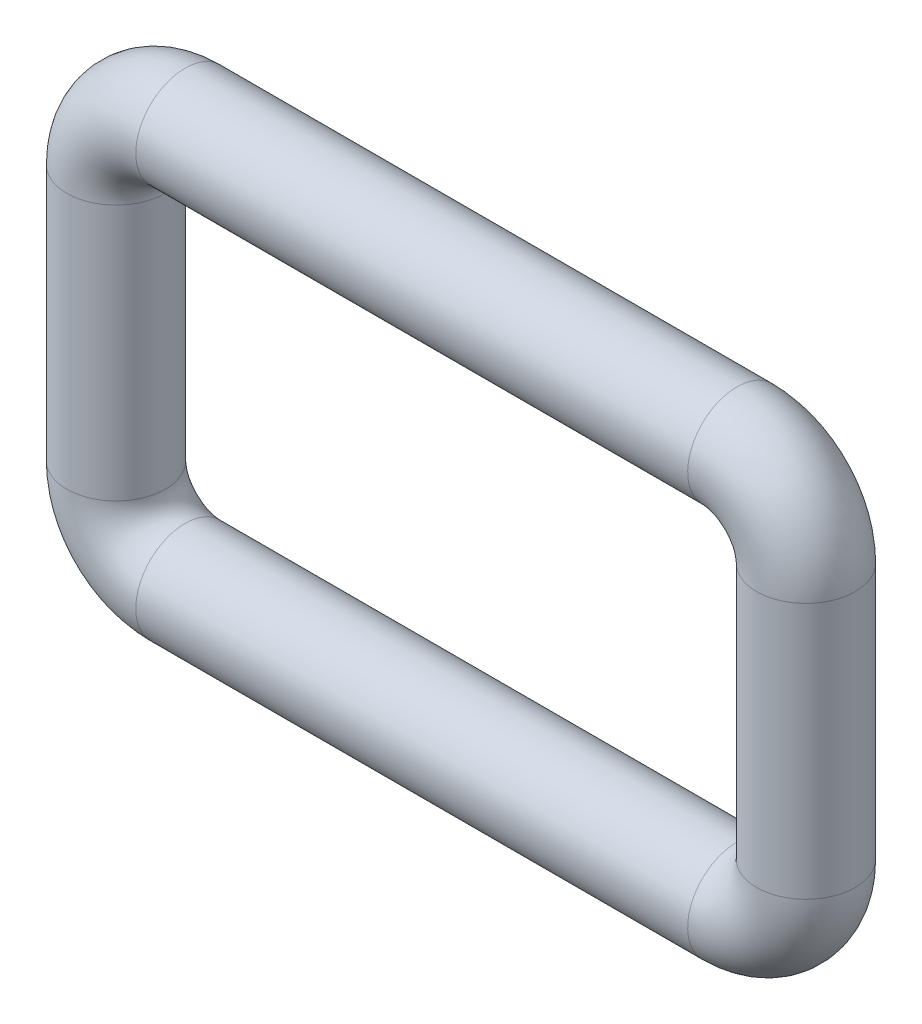
ISO-10303-21;
HEADER;
FILE_DESCRIPTION(('STEP AP214'),'2;1');
FILE_NAME('part.step','',(''),(''),'','','');
FILE_SCHEMA(('AUTOMOTIVE_DESIGN { 1 0 10303 214 1 1 1 1 }'));
ENDSEC;
DATA;
#1=APPLICATION_CONTEXT('core data for automotive mechanical design processes');
#2=APPLICATION_PROTOCOL_DEFINITION('international standard','automotive_design',2000,#1);
#3=PRODUCT_CONTEXT('',#1,'mechanical');
#4=PRODUCT('Part','Part','',(#3));
#5=PRODUCT_RELATED_PRODUCT_CATEGORY('part','',(#4));
#6=PRODUCT_DEFINITION_FORMATION('','',#4);
#7=PRODUCT_DEFINITION_CONTEXT('part definition',#1,'design');
#8=PRODUCT_DEFINITION('design','',#6,#7);
#9=PRODUCT_DEFINITION_SHAPE('','',#8);
#10=(LENGTH_UNIT() NAMED_UNIT(*) SI_UNIT(.MILLI.,.METRE.));
#11=(NAMED_UNIT(*) PLANE_ANGLE_UNIT() SI_UNIT($,.RADIAN.));
#12=(NAMED_UNIT(*) SI_UNIT($,.STERADIAN.) SOLID_ANGLE_UNIT());
#13=UNCERTAINTY_MEASURE_WITH_UNIT(LENGTH_MEASURE(1.E-05),#10,'distance_accuracy_value','');
#14=(GEOMETRIC_REPRESENTATION_CONTEXT(3) GLOBAL_UNCERTAINTY_ASSIGNED_CONTEXT((#13)) GLOBAL_UNIT_ASSIGNED_CONTEXT((#10,
#11,#12)) REPRESENTATION_CONTEXT('',''));
#15=CARTESIAN_POINT('',(0.,0.,0.));
#16=DIRECTION('',(0.,0.,1.));
#17=DIRECTION('',(1.,0.,0.));
#18=AXIS2_PLACEMENT_3D('',#15,#16,#17);
#19=CARTESIAN_POINT('',(5.24,-17.7287116222688,8.76361494235009));
#20=DIRECTION('',(0.,1.,0.));
#21=DIRECTION('',(-1.,0.,0.));
#22=AXIS2_PLACEMENT_3D('',#19,#20,#21);
#23=CYLINDRICAL_SURFACE('',#22,0.6);
#24=CARTESIAN_POINT('',(5.24,-14.6087116222688,8.76361494235006));
#25=DIRECTION('',(0.,-1.,0.));
#26=DIRECTION('',(1.,0.,0.));
#27=AXIS2_PLACEMENT_3D('',#24,#25,#26);
#28=CIRCLE('',#27,0.6);
#29=CARTESIAN_POINT('',(5.84,-14.6087116222688,8.76361494235008));
#30=VERTEX_POINT('',#29);
#31=EDGE_CURVE('E103',#30,#30,#28,.T.);
#32=ORIENTED_EDGE('',*,*,#31,.T.);
#33=DIRECTION('',(0.,-1.,0.));
#34=VECTOR('',#33,1.);
#35=CARTESIAN_POINT('',(5.84,-17.7287116222688,8.76361494235009));
#36=LINE('',#35,#34);
#37=CARTESIAN_POINT('',(5.84,-17.7287116222688,8.76361494235008));
#38=VERTEX_POINT('',#37);
#39=EDGE_CURVE('E11',#30,#38,#36,.T.);
#40=ORIENTED_EDGE('',*,*,#39,.T.);
#41=CARTESIAN_POINT('',(5.24,-17.7287116222688,8.76361494235009));
#42=DIRECTION('',(0.,-1.,0.));
#43=DIRECTION('',(1.,0.,0.));
#44=AXIS2_PLACEMENT_3D('',#41,#42,#43);
#45=CIRCLE('',#44,0.6);
#46=EDGE_CURVE('E110',#38,#38,#45,.T.);
#47=ORIENTED_EDGE('',*,*,#46,.F.);
#48=ORIENTED_EDGE('',*,*,#39,.F.);
#49=EDGE_LOOP('',(#32,#40,#47,#48));
#50=FACE_BOUND('',#49,.T.);
#51=ADVANCED_FACE('F16',(#50),#23,.T.);
#52=CARTESIAN_POINT('',(6.08,-13.7687116222688,8.76361494235005));
#53=DIRECTION('',(1.,0.,0.));
#54=DIRECTION('',(0.,1.,0.));
#55=AXIS2_PLACEMENT_3D('',#52,#53,#54);
#56=CYLINDRICAL_SURFACE('',#55,0.6);
#57=CARTESIAN_POINT('',(12.8,-13.7687116222688,8.76361494235005));
#58=DIRECTION('',(-1.,0.,0.));
#59=DIRECTION('',(0.,-1.,0.));
#60=AXIS2_PLACEMENT_3D('',#57,#58,#59);
#61=CIRCLE('',#60,0.6);
#62=CARTESIAN_POINT('',(12.8,-14.3687116222688,8.76361494235006));
#63=VERTEX_POINT('',#62);
#64=EDGE_CURVE('E91',#63,#63,#61,.T.);
#65=ORIENTED_EDGE('',*,*,#64,.T.);
#66=DIRECTION('',(-1.,0.,0.));
#67=VECTOR('',#66,1.);
#68=CARTESIAN_POINT('',(6.08,-14.3687116222688,8.76361494235006));
#69=LINE('',#68,#67);
#70=CARTESIAN_POINT('',(6.08,-14.3687116222688,8.76361494235006));
#71=VERTEX_POINT('',#70);
#72=EDGE_CURVE('E27',#63,#71,#69,.T.);
#73=ORIENTED_EDGE('',*,*,#72,.T.);
#74=CARTESIAN_POINT('',(6.08,-13.7687116222688,8.76361494235005));
#75=DIRECTION('',(-1.,0.,0.));
#76=DIRECTION('',(0.,-1.,0.));
#77=AXIS2_PLACEMENT_3D('',#74,#75,#76);
#78=CIRCLE('',#77,0.6);
#79=EDGE_CURVE('E104',#71,#71,#78,.T.);
#80=ORIENTED_EDGE('',*,*,#79,.F.);
#81=ORIENTED_EDGE('',*,*,#72,.F.);
#82=EDGE_LOOP('',(#65,#73,#80,#81));
#83=FACE_BOUND('',#82,.T.);
#84=ADVANCED_FACE('F137',(#83),#56,.T.);
#85=CARTESIAN_POINT('',(13.64,-14.6087116222688,8.76361494235006));
#86=DIRECTION('',(0.,-1.,0.));
#87=DIRECTION('',(1.,0.,0.));
#88=AXIS2_PLACEMENT_3D('',#85,#86,#87);
#89=CYLINDRICAL_SURFACE('',#88,0.6);
#90=CARTESIAN_POINT('',(13.64,-17.7287116222688,8.76361494235009));
#91=DIRECTION('',(0.,1.,0.));
#92=DIRECTION('',(-1.,0.,0.));
#93=AXIS2_PLACEMENT_3D('',#90,#91,#92);
#94=CIRCLE('',#93,0.6);
#95=CARTESIAN_POINT('',(13.04,-17.7287116222688,8.76361494235008));
#96=VERTEX_POINT('',#95);
#97=EDGE_CURVE('E76',#96,#96,#94,.T.);
#98=ORIENTED_EDGE('',*,*,#97,.T.);
#99=DIRECTION('',(0.,1.,0.));
#100=VECTOR('',#99,1.);
#101=CARTESIAN_POINT('',(13.04,-14.6087116222688,8.76361494235006));
#102=LINE('',#101,#100);
#103=CARTESIAN_POINT('',(13.04,-14.6087116222688,8.76361494235008));
#104=VERTEX_POINT('',#103);
#105=EDGE_CURVE('E69',#96,#104,#102,.T.);
#106=ORIENTED_EDGE('',*,*,#105,.T.);
#107=CARTESIAN_POINT('',(13.64,-14.6087116222688,8.76361494235006));
#108=DIRECTION('',(0.,1.,0.));
#109=DIRECTION('',(-1.,0.,0.));
#110=AXIS2_PLACEMENT_3D('',#107,#108,#109);
#111=CIRCLE('',#110,0.6);
#112=EDGE_CURVE('E84',#104,#104,#111,.T.);
#113=ORIENTED_EDGE('',*,*,#112,.F.);
#114=ORIENTED_EDGE('',*,*,#105,.F.);
#115=EDGE_LOOP('',(#98,#106,#113,#114));
#116=FACE_BOUND('',#115,.T.);
#117=ADVANCED_FACE('F18',(#116),#89,.T.);
#118=CARTESIAN_POINT('',(12.8,-18.5687116222688,8.7636149423501));
#119=DIRECTION('',(-1.,0.,0.));
#120=DIRECTION('',(0.,-1.,0.));
#121=AXIS2_PLACEMENT_3D('',#118,#119,#120);
#122=CYLINDRICAL_SURFACE('',#121,0.6);
#123=CARTESIAN_POINT('',(6.08,-18.5687116222688,8.7636149423501));
#124=DIRECTION('',(1.,0.,0.));
#125=DIRECTION('',(0.,1.,0.));
#126=AXIS2_PLACEMENT_3D('',#123,#124,#125);
#127=CIRCLE('',#126,0.6);
#128=CARTESIAN_POINT('',(6.08,-17.9687116222688,8.7636149423501));
#129=VERTEX_POINT('',#128);
#130=EDGE_CURVE('E67',#129,#129,#127,.T.);
#131=ORIENTED_EDGE('',*,*,#130,.T.);
#132=DIRECTION('',(1.,0.,0.));
#133=VECTOR('',#132,1.);
#134=CARTESIAN_POINT('',(12.8,-17.9687116222688,8.7636149423501));
#135=LINE('',#134,#133);
#136=CARTESIAN_POINT('',(12.8,-17.9687116222688,8.7636149423501));
#137=VERTEX_POINT('',#136);
#138=EDGE_CURVE('E20',#129,#137,#135,.T.);
#139=ORIENTED_EDGE('',*,*,#138,.T.);
#140=CARTESIAN_POINT('',(12.8,-18.5687116222688,8.7636149423501));
#141=DIRECTION('',(1.,0.,0.));
#142=DIRECTION('',(0.,1.,0.));
#143=AXIS2_PLACEMENT_3D('',#140,#141,#142);
#144=CIRCLE('',#143,0.6);
#145=EDGE_CURVE('E65',#137,#137,#144,.T.);
#146=ORIENTED_EDGE('',*,*,#145,.F.);
#147=ORIENTED_EDGE('',*,*,#138,.F.);
#148=EDGE_LOOP('',(#131,#139,#146,#147));
#149=FACE_BOUND('',#148,.T.);
#150=ADVANCED_FACE('F63',(#149),#122,.T.);
#151=CARTESIAN_POINT('',(6.08,-17.7287116222688,8.76361494235009));
#152=DIRECTION('',(0.,0.,-1.));
#153=DIRECTION('',(0.,1.,0.));
#154=AXIS2_PLACEMENT_3D('',#151,#152,#153);
#155=TOROIDAL_SURFACE('',#154,0.84,0.6);
#156=ORIENTED_EDGE('',*,*,#46,.T.);
#157=CARTESIAN_POINT('',(6.08,-17.7287116222688,8.76361494235009));
#158=DIRECTION('',(0.,0.,1.));
#159=DIRECTION('',(0.,1.,0.));
#160=AXIS2_PLACEMENT_3D('',#157,#158,#159);
#161=CIRCLE('',#160,0.24);
#162=EDGE_CURVE('E95',#38,#129,#161,.T.);
#163=ORIENTED_EDGE('',*,*,#162,.T.);
#164=ORIENTED_EDGE('',*,*,#130,.F.);
#165=ORIENTED_EDGE('',*,*,#162,.F.);
#166=EDGE_LOOP('',(#156,#163,#164,#165));
#167=FACE_BOUND('',#166,.T.);
#168=ADVANCED_FACE('F128',(#167),#155,.T.);
#169=CARTESIAN_POINT('',(6.08,-14.6087116222688,8.76361494235006));
#170=DIRECTION('',(0.,0.,-1.));
#171=DIRECTION('',(0.,1.,0.));
#172=AXIS2_PLACEMENT_3D('',#169,#170,#171);
#173=TOROIDAL_SURFACE('',#172,0.84,0.6);
#174=ORIENTED_EDGE('',*,*,#79,.T.);
#175=CARTESIAN_POINT('',(6.08,-14.6087116222688,8.76361494235006));
#176=DIRECTION('',(0.,0.,1.));
#177=DIRECTION('',(0.,1.,0.));
#178=AXIS2_PLACEMENT_3D('',#175,#176,#177);
#179=CIRCLE('',#178,0.24);
#180=EDGE_CURVE('E99',#71,#30,#179,.T.);
#181=ORIENTED_EDGE('',*,*,#180,.T.);
#182=ORIENTED_EDGE('',*,*,#31,.F.);
#183=ORIENTED_EDGE('',*,*,#180,.F.);
#184=EDGE_LOOP('',(#174,#181,#182,#183));
#185=FACE_BOUND('',#184,.T.);
#186=ADVANCED_FACE('F134',(#185),#173,.T.);
#187=CARTESIAN_POINT('',(12.8,-14.6087116222688,8.76361494235006));
#188=DIRECTION('',(0.,0.,-1.));
#189=DIRECTION('',(0.,1.,0.));
#190=AXIS2_PLACEMENT_3D('',#187,#188,#189);
#191=TOROIDAL_SURFACE('',#190,0.84,0.6);
#192=ORIENTED_EDGE('',*,*,#112,.T.);
#193=CARTESIAN_POINT('',(12.8,-14.6087116222688,8.76361494235006));
#194=DIRECTION('',(0.,0.,1.));
#195=DIRECTION('',(0.,1.,0.));
#196=AXIS2_PLACEMENT_3D('',#193,#194,#195);
#197=CIRCLE('',#196,0.24);
#198=EDGE_CURVE('E88',#104,#63,#197,.T.);
#199=ORIENTED_EDGE('',*,*,#198,.T.);
#200=ORIENTED_EDGE('',*,*,#64,.F.);
#201=ORIENTED_EDGE('',*,*,#198,.F.);
#202=EDGE_LOOP('',(#192,#199,#200,#201));
#203=FACE_BOUND('',#202,.T.);
#204=ADVANCED_FACE('F141',(#203),#191,.T.);
#205=CARTESIAN_POINT('',(12.8,-17.7287116222688,8.76361494235009));
#206=DIRECTION('',(0.,0.,-1.));
#207=DIRECTION('',(0.,1.,0.));
#208=AXIS2_PLACEMENT_3D('',#205,#206,#207);
#209=TOROIDAL_SURFACE('',#208,0.84,0.6);
#210=ORIENTED_EDGE('',*,*,#145,.T.);
#211=CARTESIAN_POINT('',(12.8,-17.7287116222688,8.76361494235009));
#212=DIRECTION('',(0.,0.,1.));
#213=DIRECTION('',(0.,1.,0.));
#214=AXIS2_PLACEMENT_3D('',#211,#212,#213);
#215=CIRCLE('',#214,0.24);
#216=EDGE_CURVE('E73',#137,#96,#215,.T.);
#217=ORIENTED_EDGE('',*,*,#216,.T.);
#218=ORIENTED_EDGE('',*,*,#97,.F.);
#219=ORIENTED_EDGE('',*,*,#216,.F.);
#220=EDGE_LOOP('',(#210,#217,#218,#219));
#221=FACE_BOUND('',#220,.T.);
#222=ADVANCED_FACE('F74',(#221),#209,.T.);
#223=CLOSED_SHELL('',(#51,#84,#117,#150,#168,#186,#204,#222));
#224=MANIFOLD_SOLID_BREP('B1',#223);
#225=ADVANCED_BREP_SHAPE_REPRESENTATION('',(#18,#224),#14);
#226=SHAPE_DEFINITION_REPRESENTATION(#9,#225);
ENDSEC;
END-ISO-10303-21;
